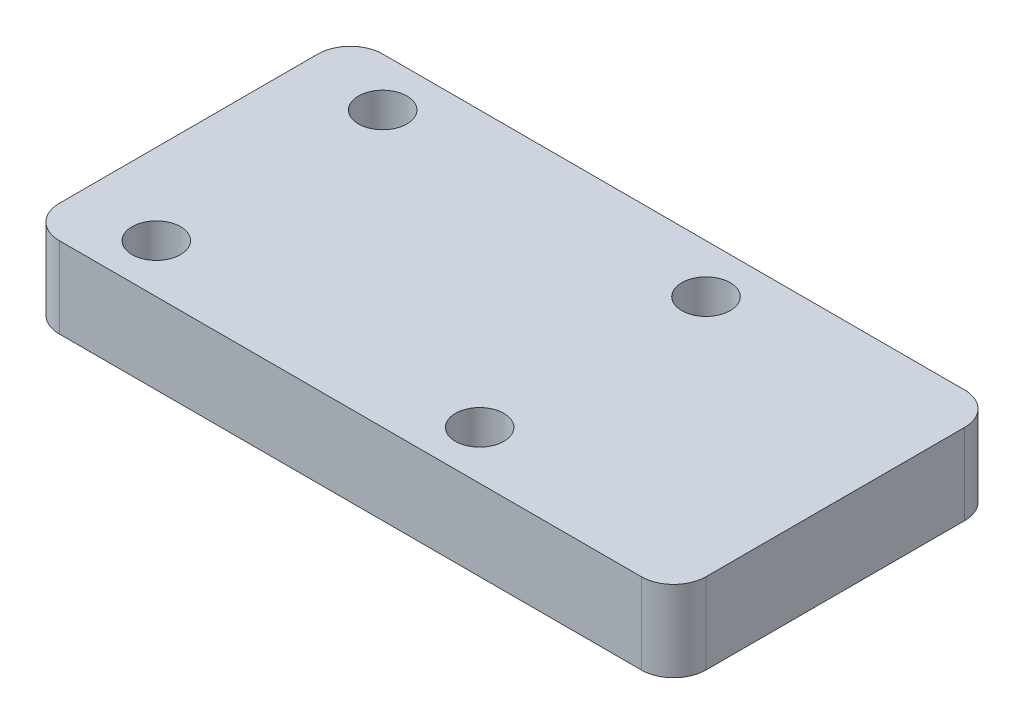
ISO-10303-21;
HEADER;
FILE_DESCRIPTION(('STEP AP214'),'2;1');
FILE_NAME('part.step','',(''),(''),'','','');
FILE_SCHEMA(('AUTOMOTIVE_DESIGN { 1 0 10303 214 1 1 1 1 }'));
ENDSEC;
DATA;
#1=APPLICATION_CONTEXT('core data for automotive mechanical design processes');
#2=APPLICATION_PROTOCOL_DEFINITION('international standard','automotive_design',2000,#1);
#3=PRODUCT_CONTEXT('',#1,'mechanical');
#4=PRODUCT('Part','Part','',(#3));
#5=PRODUCT_RELATED_PRODUCT_CATEGORY('part','',(#4));
#6=PRODUCT_DEFINITION_FORMATION('','',#4);
#7=PRODUCT_DEFINITION_CONTEXT('part definition',#1,'design');
#8=PRODUCT_DEFINITION('design','',#6,#7);
#9=PRODUCT_DEFINITION_SHAPE('','',#8);
#10=(LENGTH_UNIT() NAMED_UNIT(*) SI_UNIT(.MILLI.,.METRE.));
#11=(NAMED_UNIT(*) PLANE_ANGLE_UNIT() SI_UNIT($,.RADIAN.));
#12=(NAMED_UNIT(*) SI_UNIT($,.STERADIAN.) SOLID_ANGLE_UNIT());
#13=UNCERTAINTY_MEASURE_WITH_UNIT(LENGTH_MEASURE(1.E-05),#10,'distance_accuracy_value','');
#14=(GEOMETRIC_REPRESENTATION_CONTEXT(3) GLOBAL_UNCERTAINTY_ASSIGNED_CONTEXT((#13)) GLOBAL_UNIT_ASSIGNED_CONTEXT((#10,
#11,#12)) REPRESENTATION_CONTEXT('',''));
#15=CARTESIAN_POINT('',(0.,0.,0.));
#16=DIRECTION('',(0.,0.,1.));
#17=DIRECTION('',(1.,0.,0.));
#18=AXIS2_PLACEMENT_3D('',#15,#16,#17);
#19=CARTESIAN_POINT('',(0.,5.,0.));
#20=DIRECTION('',(0.,-1.,0.));
#21=DIRECTION('',(0.,0.,-1.));
#22=AXIS2_PLACEMENT_3D('',#19,#20,#21);
#23=PLANE('',#22);
#24=DIRECTION('',(-1.,0.,0.));
#25=VECTOR('',#24,1.);
#26=CARTESIAN_POINT('',(0.,5.,-10.));
#27=LINE('',#26,#25);
#28=CARTESIAN_POINT('',(38.,5.,-9.99999999999999));
#29=VERTEX_POINT('',#28);
#30=CARTESIAN_POINT('',(2.,5.,-10.));
#31=VERTEX_POINT('',#30);
#32=EDGE_CURVE('E148',#29,#31,#27,.T.);
#33=ORIENTED_EDGE('',*,*,#32,.T.);
#34=CARTESIAN_POINT('',(2.,5.,-8.));
#35=DIRECTION('',(0.,-1.,0.));
#36=DIRECTION('',(0.,0.,-1.));
#37=AXIS2_PLACEMENT_3D('',#34,#35,#36);
#38=CIRCLE('',#37,2.);
#39=CARTESIAN_POINT('',(0.,5.,-8.));
#40=VERTEX_POINT('',#39);
#41=EDGE_CURVE('E163',#31,#40,#38,.F.);
#42=ORIENTED_EDGE('',*,*,#41,.T.);
#43=DIRECTION('',(0.,0.,1.));
#44=VECTOR('',#43,1.);
#45=CARTESIAN_POINT('',(0.,5.,10.));
#46=LINE('',#45,#44);
#47=CARTESIAN_POINT('',(0.,5.,8.00000000000001));
#48=VERTEX_POINT('',#47);
#49=EDGE_CURVE('E126',#40,#48,#46,.T.);
#50=ORIENTED_EDGE('',*,*,#49,.T.);
#51=CARTESIAN_POINT('',(2.,5.,8.00000000000001));
#52=DIRECTION('',(0.,-1.,0.));
#53=DIRECTION('',(0.,0.,-1.));
#54=AXIS2_PLACEMENT_3D('',#51,#52,#53);
#55=CIRCLE('',#54,2.);
#56=CARTESIAN_POINT('',(2.,5.,10.));
#57=VERTEX_POINT('',#56);
#58=EDGE_CURVE('E159',#48,#57,#55,.F.);
#59=ORIENTED_EDGE('',*,*,#58,.T.);
#60=DIRECTION('',(1.,0.,0.));
#61=VECTOR('',#60,1.);
#62=CARTESIAN_POINT('',(0.,5.,10.));
#63=LINE('',#62,#61);
#64=CARTESIAN_POINT('',(38.,5.,10.));
#65=VERTEX_POINT('',#64);
#66=EDGE_CURVE('E172',#57,#65,#63,.T.);
#67=ORIENTED_EDGE('',*,*,#66,.T.);
#68=CARTESIAN_POINT('',(38.,5.,8.00000000000001));
#69=DIRECTION('',(0.,-1.,0.));
#70=DIRECTION('',(0.,0.,-1.));
#71=AXIS2_PLACEMENT_3D('',#68,#69,#70);
#72=CIRCLE('',#71,2.);
#73=CARTESIAN_POINT('',(40.,5.,8.00000000000001));
#74=VERTEX_POINT('',#73);
#75=EDGE_CURVE('E62',#65,#74,#72,.F.);
#76=ORIENTED_EDGE('',*,*,#75,.T.);
#77=DIRECTION('',(0.,0.,-1.));
#78=VECTOR('',#77,1.);
#79=CARTESIAN_POINT('',(40.,5.,10.));
#80=LINE('',#79,#78);
#81=CARTESIAN_POINT('',(40.,5.,-8.));
#82=VERTEX_POINT('',#81);
#83=EDGE_CURVE('E179',#74,#82,#80,.T.);
#84=ORIENTED_EDGE('',*,*,#83,.T.);
#85=CARTESIAN_POINT('',(38.,5.,-7.99999999999999));
#86=DIRECTION('',(0.,-1.,0.));
#87=DIRECTION('',(0.,0.,-1.));
#88=AXIS2_PLACEMENT_3D('',#85,#86,#87);
#89=CIRCLE('',#88,2.);
#90=EDGE_CURVE('E165',#82,#29,#89,.F.);
#91=ORIENTED_EDGE('',*,*,#90,.T.);
#92=EDGE_LOOP('',(#33,#42,#50,#59,#67,#76,#84,#91));
#93=FACE_BOUND('',#92,.T.);
#94=CARTESIAN_POINT('',(5.,5.,7.00000000000001));
#95=DIRECTION('',(0.,1.,0.));
#96=DIRECTION('',(0.,0.,1.));
#97=AXIS2_PLACEMENT_3D('',#94,#95,#96);
#98=CIRCLE('',#97,1.5);
#99=CARTESIAN_POINT('',(5.,5.,8.50000000000001));
#100=VERTEX_POINT('',#99);
#101=EDGE_CURVE('E140',#100,#100,#98,.T.);
#102=ORIENTED_EDGE('',*,*,#101,.F.);
#103=EDGE_LOOP('',(#102));
#104=FACE_BOUND('',#103,.T.);
#105=CARTESIAN_POINT('',(25.,5.,7.));
#106=DIRECTION('',(0.,1.,0.));
#107=DIRECTION('',(0.,0.,1.));
#108=AXIS2_PLACEMENT_3D('',#105,#106,#107);
#109=CIRCLE('',#108,1.5);
#110=CARTESIAN_POINT('',(25.,5.,8.50000000000001));
#111=VERTEX_POINT('',#110);
#112=EDGE_CURVE('E194',#111,#111,#109,.T.);
#113=ORIENTED_EDGE('',*,*,#112,.F.);
#114=EDGE_LOOP('',(#113));
#115=FACE_BOUND('',#114,.T.);
#116=CARTESIAN_POINT('',(25.,5.,-7.));
#117=DIRECTION('',(0.,1.,0.));
#118=DIRECTION('',(0.,0.,-1.));
#119=AXIS2_PLACEMENT_3D('',#116,#117,#118);
#120=CIRCLE('',#119,1.5);
#121=CARTESIAN_POINT('',(25.,5.,-8.5));
#122=VERTEX_POINT('',#121);
#123=EDGE_CURVE('E200',#122,#122,#120,.T.);
#124=ORIENTED_EDGE('',*,*,#123,.F.);
#125=EDGE_LOOP('',(#124));
#126=FACE_BOUND('',#125,.T.);
#127=CARTESIAN_POINT('',(5.,5.,-7.));
#128=DIRECTION('',(0.,1.,0.));
#129=DIRECTION('',(0.,0.,-1.));
#130=AXIS2_PLACEMENT_3D('',#127,#128,#129);
#131=CIRCLE('',#130,1.5);
#132=CARTESIAN_POINT('',(5.,5.,-8.5));
#133=VERTEX_POINT('',#132);
#134=EDGE_CURVE('E202',#133,#133,#131,.T.);
#135=ORIENTED_EDGE('',*,*,#134,.F.);
#136=EDGE_LOOP('',(#135));
#137=FACE_BOUND('',#136,.T.);
#138=ADVANCED_FACE('F41',(#93,#104,#115,#126,#137),#23,.F.);
#139=CARTESIAN_POINT('',(0.,0.,0.));
#140=DIRECTION('',(0.,-1.,0.));
#141=DIRECTION('',(0.,0.,-1.));
#142=AXIS2_PLACEMENT_3D('',#139,#140,#141);
#143=PLANE('',#142);
#144=CARTESIAN_POINT('',(25.,0.,-7.));
#145=DIRECTION('',(0.,1.,0.));
#146=DIRECTION('',(0.,0.,-1.));
#147=AXIS2_PLACEMENT_3D('',#144,#145,#146);
#148=CIRCLE('',#147,1.5);
#149=CARTESIAN_POINT('',(25.,0.,-8.5));
#150=VERTEX_POINT('',#149);
#151=EDGE_CURVE('E205',#150,#150,#148,.T.);
#152=ORIENTED_EDGE('',*,*,#151,.T.);
#153=EDGE_LOOP('',(#152));
#154=FACE_BOUND('',#153,.T.);
#155=CARTESIAN_POINT('',(5.,0.,7.00000000000001));
#156=DIRECTION('',(0.,1.,0.));
#157=DIRECTION('',(0.,0.,1.));
#158=AXIS2_PLACEMENT_3D('',#155,#156,#157);
#159=CIRCLE('',#158,1.5);
#160=CARTESIAN_POINT('',(5.,0.,8.50000000000001));
#161=VERTEX_POINT('',#160);
#162=EDGE_CURVE('E141',#161,#161,#159,.T.);
#163=ORIENTED_EDGE('',*,*,#162,.T.);
#164=EDGE_LOOP('',(#163));
#165=FACE_BOUND('',#164,.T.);
#166=DIRECTION('',(0.,0.,1.));
#167=VECTOR('',#166,1.);
#168=CARTESIAN_POINT('',(0.,0.,10.));
#169=LINE('',#168,#167);
#170=CARTESIAN_POINT('',(0.,0.,-8.));
#171=VERTEX_POINT('',#170);
#172=CARTESIAN_POINT('',(0.,0.,8.00000000000001));
#173=VERTEX_POINT('',#172);
#174=EDGE_CURVE('E121',#171,#173,#169,.T.);
#175=ORIENTED_EDGE('',*,*,#174,.F.);
#176=CARTESIAN_POINT('',(2.,0.,-8.));
#177=DIRECTION('',(0.,-1.,0.));
#178=DIRECTION('',(0.,0.,-1.));
#179=AXIS2_PLACEMENT_3D('',#176,#177,#178);
#180=CIRCLE('',#179,2.);
#181=CARTESIAN_POINT('',(2.,0.,-10.));
#182=VERTEX_POINT('',#181);
#183=EDGE_CURVE('E107',#171,#182,#180,.T.);
#184=ORIENTED_EDGE('',*,*,#183,.T.);
#185=DIRECTION('',(-1.,0.,0.));
#186=VECTOR('',#185,1.);
#187=CARTESIAN_POINT('',(0.,0.,-10.));
#188=LINE('',#187,#186);
#189=CARTESIAN_POINT('',(38.,0.,-9.99999999999999));
#190=VERTEX_POINT('',#189);
#191=EDGE_CURVE('E147',#190,#182,#188,.T.);
#192=ORIENTED_EDGE('',*,*,#191,.F.);
#193=CARTESIAN_POINT('',(38.,0.,-7.99999999999999));
#194=DIRECTION('',(0.,-1.,0.));
#195=DIRECTION('',(0.,0.,-1.));
#196=AXIS2_PLACEMENT_3D('',#193,#194,#195);
#197=CIRCLE('',#196,2.);
#198=CARTESIAN_POINT('',(40.,0.,-8.));
#199=VERTEX_POINT('',#198);
#200=EDGE_CURVE('E120',#190,#199,#197,.T.);
#201=ORIENTED_EDGE('',*,*,#200,.T.);
#202=DIRECTION('',(0.,0.,-1.));
#203=VECTOR('',#202,1.);
#204=CARTESIAN_POINT('',(40.,0.,10.));
#205=LINE('',#204,#203);
#206=CARTESIAN_POINT('',(40.,0.,8.00000000000001));
#207=VERTEX_POINT('',#206);
#208=EDGE_CURVE('E136',#207,#199,#205,.T.);
#209=ORIENTED_EDGE('',*,*,#208,.F.);
#210=CARTESIAN_POINT('',(38.,0.,8.00000000000001));
#211=DIRECTION('',(0.,-1.,0.));
#212=DIRECTION('',(0.,0.,-1.));
#213=AXIS2_PLACEMENT_3D('',#210,#211,#212);
#214=CIRCLE('',#213,2.);
#215=CARTESIAN_POINT('',(38.,0.,10.));
#216=VERTEX_POINT('',#215);
#217=EDGE_CURVE('E129',#207,#216,#214,.T.);
#218=ORIENTED_EDGE('',*,*,#217,.T.);
#219=DIRECTION('',(1.,0.,0.));
#220=VECTOR('',#219,1.);
#221=CARTESIAN_POINT('',(0.,0.,10.));
#222=LINE('',#221,#220);
#223=CARTESIAN_POINT('',(2.,0.,10.));
#224=VERTEX_POINT('',#223);
#225=EDGE_CURVE('E137',#224,#216,#222,.T.);
#226=ORIENTED_EDGE('',*,*,#225,.F.);
#227=CARTESIAN_POINT('',(2.,0.,8.00000000000001));
#228=DIRECTION('',(0.,-1.,0.));
#229=DIRECTION('',(0.,0.,-1.));
#230=AXIS2_PLACEMENT_3D('',#227,#228,#229);
#231=CIRCLE('',#230,2.);
#232=EDGE_CURVE('E131',#224,#173,#231,.T.);
#233=ORIENTED_EDGE('',*,*,#232,.T.);
#234=EDGE_LOOP('',(#175,#184,#192,#201,#209,#218,#226,#233));
#235=FACE_BOUND('',#234,.T.);
#236=CARTESIAN_POINT('',(25.,0.,7.));
#237=DIRECTION('',(0.,1.,0.));
#238=DIRECTION('',(0.,0.,1.));
#239=AXIS2_PLACEMENT_3D('',#236,#237,#238);
#240=CIRCLE('',#239,1.5);
#241=CARTESIAN_POINT('',(25.,0.,8.50000000000001));
#242=VERTEX_POINT('',#241);
#243=EDGE_CURVE('E198',#242,#242,#240,.T.);
#244=ORIENTED_EDGE('',*,*,#243,.T.);
#245=EDGE_LOOP('',(#244));
#246=FACE_BOUND('',#245,.T.);
#247=CARTESIAN_POINT('',(5.,0.,-7.));
#248=DIRECTION('',(0.,1.,0.));
#249=DIRECTION('',(0.,0.,-1.));
#250=AXIS2_PLACEMENT_3D('',#247,#248,#249);
#251=CIRCLE('',#250,1.5);
#252=CARTESIAN_POINT('',(5.,0.,-8.5));
#253=VERTEX_POINT('',#252);
#254=EDGE_CURVE('E208',#253,#253,#251,.T.);
#255=ORIENTED_EDGE('',*,*,#254,.T.);
#256=EDGE_LOOP('',(#255));
#257=FACE_BOUND('',#256,.T.);
#258=ADVANCED_FACE('F134',(#154,#165,#235,#246,#257),#143,.T.);
#259=CARTESIAN_POINT('',(0.,5.,10.));
#260=DIRECTION('',(1.,0.,0.));
#261=DIRECTION('',(0.,0.,-1.));
#262=AXIS2_PLACEMENT_3D('',#259,#260,#261);
#263=PLANE('',#262);
#264=ORIENTED_EDGE('',*,*,#49,.F.);
#265=DIRECTION('',(0.,-1.,0.));
#266=VECTOR('',#265,1.);
#267=CARTESIAN_POINT('',(0.,5.,-8.));
#268=LINE('',#267,#266);
#269=EDGE_CURVE('E115',#40,#171,#268,.T.);
#270=ORIENTED_EDGE('',*,*,#269,.T.);
#271=ORIENTED_EDGE('',*,*,#174,.T.);
#272=DIRECTION('',(0.,-1.,0.));
#273=VECTOR('',#272,1.);
#274=CARTESIAN_POINT('',(0.,5.,8.00000000000001));
#275=LINE('',#274,#273);
#276=EDGE_CURVE('E128',#173,#48,#275,.F.);
#277=ORIENTED_EDGE('',*,*,#276,.T.);
#278=EDGE_LOOP('',(#264,#270,#271,#277));
#279=FACE_BOUND('',#278,.T.);
#280=ADVANCED_FACE('F124',(#279),#263,.F.);
#281=CARTESIAN_POINT('',(0.,5.,10.));
#282=DIRECTION('',(0.,0.,-1.));
#283=DIRECTION('',(-1.,0.,0.));
#284=AXIS2_PLACEMENT_3D('',#281,#282,#283);
#285=PLANE('',#284);
#286=ORIENTED_EDGE('',*,*,#66,.F.);
#287=DIRECTION('',(0.,-1.,0.));
#288=VECTOR('',#287,1.);
#289=CARTESIAN_POINT('',(2.,5.,10.));
#290=LINE('',#289,#288);
#291=EDGE_CURVE('E11',#57,#224,#290,.T.);
#292=ORIENTED_EDGE('',*,*,#291,.T.);
#293=ORIENTED_EDGE('',*,*,#225,.T.);
#294=DIRECTION('',(0.,-1.,0.));
#295=VECTOR('',#294,1.);
#296=CARTESIAN_POINT('',(38.,5.,10.));
#297=LINE('',#296,#295);
#298=EDGE_CURVE('E47',#216,#65,#297,.F.);
#299=ORIENTED_EDGE('',*,*,#298,.T.);
#300=EDGE_LOOP('',(#286,#292,#293,#299));
#301=FACE_BOUND('',#300,.T.);
#302=ADVANCED_FACE('F174',(#301),#285,.F.);
#303=CARTESIAN_POINT('',(40.,5.,10.));
#304=DIRECTION('',(-1.,0.,0.));
#305=DIRECTION('',(0.,0.,1.));
#306=AXIS2_PLACEMENT_3D('',#303,#304,#305);
#307=PLANE('',#306);
#308=ORIENTED_EDGE('',*,*,#208,.T.);
#309=DIRECTION('',(0.,-1.,0.));
#310=VECTOR('',#309,1.);
#311=CARTESIAN_POINT('',(40.,5.,-8.));
#312=LINE('',#311,#310);
#313=EDGE_CURVE('E57',#199,#82,#312,.F.);
#314=ORIENTED_EDGE('',*,*,#313,.T.);
#315=ORIENTED_EDGE('',*,*,#83,.F.);
#316=DIRECTION('',(0.,-1.,0.));
#317=VECTOR('',#316,1.);
#318=CARTESIAN_POINT('',(40.,5.,8.00000000000001));
#319=LINE('',#318,#317);
#320=EDGE_CURVE('E167',#74,#207,#319,.T.);
#321=ORIENTED_EDGE('',*,*,#320,.T.);
#322=EDGE_LOOP('',(#308,#314,#315,#321));
#323=FACE_BOUND('',#322,.T.);
#324=ADVANCED_FACE('F181',(#323),#307,.F.);
#325=CARTESIAN_POINT('',(0.,5.,-10.));
#326=DIRECTION('',(0.,0.,1.));
#327=DIRECTION('',(1.,0.,0.));
#328=AXIS2_PLACEMENT_3D('',#325,#326,#327);
#329=PLANE('',#328);
#330=ORIENTED_EDGE('',*,*,#191,.T.);
#331=DIRECTION('',(0.,-1.,0.));
#332=VECTOR('',#331,1.);
#333=CARTESIAN_POINT('',(2.,5.,-10.));
#334=LINE('',#333,#332);
#335=EDGE_CURVE('E114',#182,#31,#334,.F.);
#336=ORIENTED_EDGE('',*,*,#335,.T.);
#337=ORIENTED_EDGE('',*,*,#32,.F.);
#338=DIRECTION('',(0.,-1.,0.));
#339=VECTOR('',#338,1.);
#340=CARTESIAN_POINT('',(38.,5.,-9.99999999999999));
#341=LINE('',#340,#339);
#342=EDGE_CURVE('E117',#29,#190,#341,.T.);
#343=ORIENTED_EDGE('',*,*,#342,.T.);
#344=EDGE_LOOP('',(#330,#336,#337,#343));
#345=FACE_BOUND('',#344,.T.);
#346=ADVANCED_FACE('F186',(#345),#329,.F.);
#347=CARTESIAN_POINT('',(5.,5.,7.00000000000001));
#348=DIRECTION('',(0.,-1.,0.));
#349=DIRECTION('',(0.,0.,-1.));
#350=AXIS2_PLACEMENT_3D('',#347,#348,#349);
#351=CYLINDRICAL_SURFACE('',#350,1.5);
#352=ORIENTED_EDGE('',*,*,#101,.T.);
#353=EDGE_LOOP('',(#352));
#354=FACE_BOUND('',#353,.T.);
#355=ORIENTED_EDGE('',*,*,#162,.F.);
#356=EDGE_LOOP('',(#355));
#357=FACE_BOUND('',#356,.T.);
#358=ADVANCED_FACE('F228',(#354,#357),#351,.F.);
#359=CARTESIAN_POINT('',(25.,5.,7.));
#360=DIRECTION('',(0.,-1.,0.));
#361=DIRECTION('',(0.,0.,-1.));
#362=AXIS2_PLACEMENT_3D('',#359,#360,#361);
#363=CYLINDRICAL_SURFACE('',#362,1.5);
#364=ORIENTED_EDGE('',*,*,#112,.T.);
#365=EDGE_LOOP('',(#364));
#366=FACE_BOUND('',#365,.T.);
#367=ORIENTED_EDGE('',*,*,#243,.F.);
#368=EDGE_LOOP('',(#367));
#369=FACE_BOUND('',#368,.T.);
#370=ADVANCED_FACE('F284',(#366,#369),#363,.F.);
#371=CARTESIAN_POINT('',(25.,5.,-7.));
#372=DIRECTION('',(0.,-1.,0.));
#373=DIRECTION('',(0.,0.,-1.));
#374=AXIS2_PLACEMENT_3D('',#371,#372,#373);
#375=CYLINDRICAL_SURFACE('',#374,1.5);
#376=ORIENTED_EDGE('',*,*,#123,.T.);
#377=EDGE_LOOP('',(#376));
#378=FACE_BOUND('',#377,.T.);
#379=ORIENTED_EDGE('',*,*,#151,.F.);
#380=EDGE_LOOP('',(#379));
#381=FACE_BOUND('',#380,.T.);
#382=ADVANCED_FACE('F272',(#378,#381),#375,.F.);
#383=CARTESIAN_POINT('',(5.,5.,-7.));
#384=DIRECTION('',(0.,-1.,0.));
#385=DIRECTION('',(0.,0.,-1.));
#386=AXIS2_PLACEMENT_3D('',#383,#384,#385);
#387=CYLINDRICAL_SURFACE('',#386,1.5);
#388=ORIENTED_EDGE('',*,*,#134,.T.);
#389=EDGE_LOOP('',(#388));
#390=FACE_BOUND('',#389,.T.);
#391=ORIENTED_EDGE('',*,*,#254,.F.);
#392=EDGE_LOOP('',(#391));
#393=FACE_BOUND('',#392,.T.);
#394=ADVANCED_FACE('F212',(#390,#393),#387,.F.);
#395=CARTESIAN_POINT('',(2.,5.,-8.));
#396=DIRECTION('',(0.,-1.,0.));
#397=DIRECTION('',(0.,0.,-1.));
#398=AXIS2_PLACEMENT_3D('',#395,#396,#397);
#399=CYLINDRICAL_SURFACE('',#398,2.);
#400=ORIENTED_EDGE('',*,*,#41,.F.);
#401=ORIENTED_EDGE('',*,*,#335,.F.);
#402=ORIENTED_EDGE('',*,*,#183,.F.);
#403=ORIENTED_EDGE('',*,*,#269,.F.);
#404=EDGE_LOOP('',(#400,#401,#402,#403));
#405=FACE_BOUND('',#404,.T.);
#406=ADVANCED_FACE('F112',(#405),#399,.T.);
#407=CARTESIAN_POINT('',(38.,5.,-7.99999999999999));
#408=DIRECTION('',(0.,-1.,0.));
#409=DIRECTION('',(0.,0.,-1.));
#410=AXIS2_PLACEMENT_3D('',#407,#408,#409);
#411=CYLINDRICAL_SURFACE('',#410,2.);
#412=ORIENTED_EDGE('',*,*,#90,.F.);
#413=ORIENTED_EDGE('',*,*,#313,.F.);
#414=ORIENTED_EDGE('',*,*,#200,.F.);
#415=ORIENTED_EDGE('',*,*,#342,.F.);
#416=EDGE_LOOP('',(#412,#413,#414,#415));
#417=FACE_BOUND('',#416,.T.);
#418=ADVANCED_FACE('F189',(#417),#411,.T.);
#419=CARTESIAN_POINT('',(2.,5.,8.00000000000001));
#420=DIRECTION('',(0.,-1.,0.));
#421=DIRECTION('',(0.,0.,-1.));
#422=AXIS2_PLACEMENT_3D('',#419,#420,#421);
#423=CYLINDRICAL_SURFACE('',#422,2.);
#424=ORIENTED_EDGE('',*,*,#58,.F.);
#425=ORIENTED_EDGE('',*,*,#276,.F.);
#426=ORIENTED_EDGE('',*,*,#232,.F.);
#427=ORIENTED_EDGE('',*,*,#291,.F.);
#428=EDGE_LOOP('',(#424,#425,#426,#427));
#429=FACE_BOUND('',#428,.T.);
#430=ADVANCED_FACE('F238',(#429),#423,.T.);
#431=CARTESIAN_POINT('',(38.,5.,8.00000000000001));
#432=DIRECTION('',(0.,-1.,0.));
#433=DIRECTION('',(0.,0.,-1.));
#434=AXIS2_PLACEMENT_3D('',#431,#432,#433);
#435=CYLINDRICAL_SURFACE('',#434,2.);
#436=ORIENTED_EDGE('',*,*,#75,.F.);
#437=ORIENTED_EDGE('',*,*,#298,.F.);
#438=ORIENTED_EDGE('',*,*,#217,.F.);
#439=ORIENTED_EDGE('',*,*,#320,.F.);
#440=EDGE_LOOP('',(#436,#437,#438,#439));
#441=FACE_BOUND('',#440,.T.);
#442=ADVANCED_FACE('F43',(#441),#435,.T.);
#443=CLOSED_SHELL('',(#138,#258,#280,#302,#324,#346,#358,#370,#382,#394,#406,#418,#430,#442));
#444=MANIFOLD_SOLID_BREP('B2',#443);
#445=ADVANCED_BREP_SHAPE_REPRESENTATION('',(#18,#444),#14);
#446=SHAPE_DEFINITION_REPRESENTATION(#9,#445);
ENDSEC;
END-ISO-10303-21;
